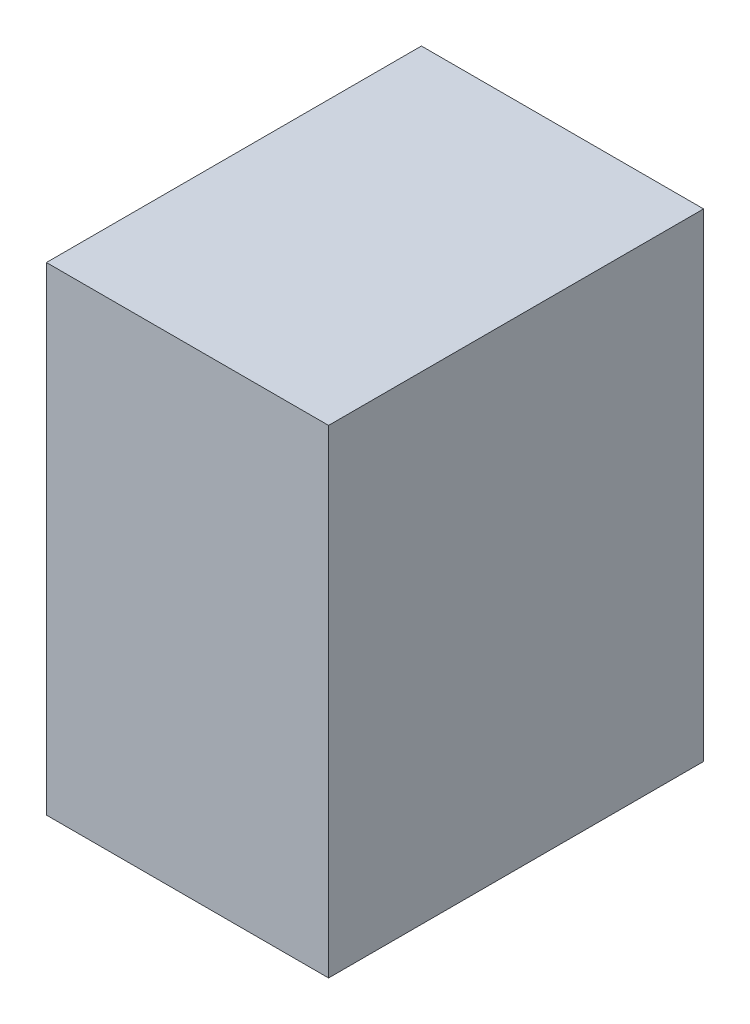
ISO-10303-21;
HEADER;
FILE_DESCRIPTION(('STEP AP214'),'2;1');
FILE_NAME('part.step','',(''),(''),'','','');
FILE_SCHEMA(('AUTOMOTIVE_DESIGN { 1 0 10303 214 1 1 1 1 }'));
ENDSEC;
DATA;
#1=APPLICATION_CONTEXT('core data for automotive mechanical design processes');
#2=APPLICATION_PROTOCOL_DEFINITION('international standard','automotive_design',2000,#1);
#3=PRODUCT_CONTEXT('',#1,'mechanical');
#4=PRODUCT('Part','Part','',(#3));
#5=PRODUCT_RELATED_PRODUCT_CATEGORY('part','',(#4));
#6=PRODUCT_DEFINITION_FORMATION('','',#4);
#7=PRODUCT_DEFINITION_CONTEXT('part definition',#1,'design');
#8=PRODUCT_DEFINITION('design','',#6,#7);
#9=PRODUCT_DEFINITION_SHAPE('','',#8);
#10=(LENGTH_UNIT() NAMED_UNIT(*) SI_UNIT(.MILLI.,.METRE.));
#11=(NAMED_UNIT(*) PLANE_ANGLE_UNIT() SI_UNIT($,.RADIAN.));
#12=(NAMED_UNIT(*) SI_UNIT($,.STERADIAN.) SOLID_ANGLE_UNIT());
#13=UNCERTAINTY_MEASURE_WITH_UNIT(LENGTH_MEASURE(1.E-05),#10,'distance_accuracy_value','');
#14=(GEOMETRIC_REPRESENTATION_CONTEXT(3) GLOBAL_UNCERTAINTY_ASSIGNED_CONTEXT((#13)) GLOBAL_UNIT_ASSIGNED_CONTEXT((#10,
#11,#12)) REPRESENTATION_CONTEXT('',''));
#15=CARTESIAN_POINT('',(0.,0.,0.));
#16=DIRECTION('',(0.,0.,1.));
#17=DIRECTION('',(1.,0.,0.));
#18=AXIS2_PLACEMENT_3D('',#15,#16,#17);
#19=CARTESIAN_POINT('',(-0.3762,-0.6,1.));
#20=DIRECTION('',(1.,0.,0.));
#21=DIRECTION('',(0.,0.,-1.));
#22=AXIS2_PLACEMENT_3D('',#19,#20,#21);
#23=PLANE('',#22);
#24=DIRECTION('',(0.,-1.,0.));
#25=VECTOR('',#24,1.);
#26=CARTESIAN_POINT('',(-0.3762,-0.6,0.));
#27=LINE('',#26,#25);
#28=CARTESIAN_POINT('',(-0.3762,0.6762,0.));
#29=VERTEX_POINT('',#28);
#30=CARTESIAN_POINT('',(-0.3762,-0.6,0.));
#31=VERTEX_POINT('',#30);
#32=EDGE_CURVE('E95',#29,#31,#27,.T.);
#33=ORIENTED_EDGE('',*,*,#32,.T.);
#34=DIRECTION('',(0.,0.,-1.));
#35=VECTOR('',#34,1.);
#36=CARTESIAN_POINT('',(-0.3762,-0.6,1.));
#37=LINE('',#36,#35);
#38=CARTESIAN_POINT('',(-0.3762,-0.6,1.));
#39=VERTEX_POINT('',#38);
#40=EDGE_CURVE('E11',#39,#31,#37,.T.);
#41=ORIENTED_EDGE('',*,*,#40,.F.);
#42=DIRECTION('',(0.,-1.,0.));
#43=VECTOR('',#42,1.);
#44=CARTESIAN_POINT('',(-0.3762,-0.6,1.));
#45=LINE('',#44,#43);
#46=CARTESIAN_POINT('',(-0.3762,0.6762,1.));
#47=VERTEX_POINT('',#46);
#48=EDGE_CURVE('E83',#47,#39,#45,.T.);
#49=ORIENTED_EDGE('',*,*,#48,.F.);
#50=DIRECTION('',(0.,0.,-1.));
#51=VECTOR('',#50,1.);
#52=CARTESIAN_POINT('',(-0.3762,0.6762,1.));
#53=LINE('',#52,#51);
#54=EDGE_CURVE('E91',#47,#29,#53,.T.);
#55=ORIENTED_EDGE('',*,*,#54,.T.);
#56=EDGE_LOOP('',(#33,#41,#49,#55));
#57=FACE_BOUND('',#56,.T.);
#58=ADVANCED_FACE('F32',(#57),#23,.F.);
#59=CARTESIAN_POINT('',(0.3762,-0.6,1.));
#60=DIRECTION('',(0.,1.,0.));
#61=DIRECTION('',(0.,0.,1.));
#62=AXIS2_PLACEMENT_3D('',#59,#60,#61);
#63=PLANE('',#62);
#64=DIRECTION('',(1.,0.,0.));
#65=VECTOR('',#64,1.);
#66=CARTESIAN_POINT('',(0.3762,-0.6,0.));
#67=LINE('',#66,#65);
#68=CARTESIAN_POINT('',(0.3762,-0.6,0.));
#69=VERTEX_POINT('',#68);
#70=EDGE_CURVE('E87',#31,#69,#67,.T.);
#71=ORIENTED_EDGE('',*,*,#70,.T.);
#72=DIRECTION('',(0.,0.,-1.));
#73=VECTOR('',#72,1.);
#74=CARTESIAN_POINT('',(0.3762,-0.6,1.));
#75=LINE('',#74,#73);
#76=CARTESIAN_POINT('',(0.3762,-0.6,1.));
#77=VERTEX_POINT('',#76);
#78=EDGE_CURVE('E40',#77,#69,#75,.T.);
#79=ORIENTED_EDGE('',*,*,#78,.F.);
#80=DIRECTION('',(1.,0.,0.));
#81=VECTOR('',#80,1.);
#82=CARTESIAN_POINT('',(0.3762,-0.6,1.));
#83=LINE('',#82,#81);
#84=EDGE_CURVE('E78',#39,#77,#83,.T.);
#85=ORIENTED_EDGE('',*,*,#84,.F.);
#86=ORIENTED_EDGE('',*,*,#40,.T.);
#87=EDGE_LOOP('',(#71,#79,#85,#86));
#88=FACE_BOUND('',#87,.T.);
#89=ADVANCED_FACE('F86',(#88),#63,.F.);
#90=CARTESIAN_POINT('',(0.3762,0.6762,1.));
#91=DIRECTION('',(-1.,0.,0.));
#92=DIRECTION('',(0.,0.,1.));
#93=AXIS2_PLACEMENT_3D('',#90,#91,#92);
#94=PLANE('',#93);
#95=DIRECTION('',(0.,1.,0.));
#96=VECTOR('',#95,1.);
#97=CARTESIAN_POINT('',(0.3762,0.6762,0.));
#98=LINE('',#97,#96);
#99=CARTESIAN_POINT('',(0.3762,0.6762,0.));
#100=VERTEX_POINT('',#99);
#101=EDGE_CURVE('E65',#69,#100,#98,.T.);
#102=ORIENTED_EDGE('',*,*,#101,.T.);
#103=DIRECTION('',(0.,0.,-1.));
#104=VECTOR('',#103,1.);
#105=CARTESIAN_POINT('',(0.3762,0.6762,1.));
#106=LINE('',#105,#104);
#107=CARTESIAN_POINT('',(0.3762,0.6762,1.));
#108=VERTEX_POINT('',#107);
#109=EDGE_CURVE('E88',#108,#100,#106,.T.);
#110=ORIENTED_EDGE('',*,*,#109,.F.);
#111=DIRECTION('',(0.,1.,0.));
#112=VECTOR('',#111,1.);
#113=CARTESIAN_POINT('',(0.3762,0.6762,1.));
#114=LINE('',#113,#112);
#115=EDGE_CURVE('E81',#77,#108,#114,.T.);
#116=ORIENTED_EDGE('',*,*,#115,.F.);
#117=ORIENTED_EDGE('',*,*,#78,.T.);
#118=EDGE_LOOP('',(#102,#110,#116,#117));
#119=FACE_BOUND('',#118,.T.);
#120=ADVANCED_FACE('F89',(#119),#94,.F.);
#121=CARTESIAN_POINT('',(-0.3762,0.6762,1.));
#122=DIRECTION('',(0.,-1.,0.));
#123=DIRECTION('',(0.,0.,-1.));
#124=AXIS2_PLACEMENT_3D('',#121,#122,#123);
#125=PLANE('',#124);
#126=DIRECTION('',(-1.,0.,0.));
#127=VECTOR('',#126,1.);
#128=CARTESIAN_POINT('',(-0.3762,0.6762,0.));
#129=LINE('',#128,#127);
#130=EDGE_CURVE('E71',#100,#29,#129,.T.);
#131=ORIENTED_EDGE('',*,*,#130,.T.);
#132=ORIENTED_EDGE('',*,*,#54,.F.);
#133=DIRECTION('',(-1.,0.,0.));
#134=VECTOR('',#133,1.);
#135=CARTESIAN_POINT('',(-0.3762,0.6762,1.));
#136=LINE('',#135,#134);
#137=EDGE_CURVE('E48',#108,#47,#136,.T.);
#138=ORIENTED_EDGE('',*,*,#137,.F.);
#139=ORIENTED_EDGE('',*,*,#109,.T.);
#140=EDGE_LOOP('',(#131,#132,#138,#139));
#141=FACE_BOUND('',#140,.T.);
#142=ADVANCED_FACE('F102',(#141),#125,.F.);
#143=CARTESIAN_POINT('',(0.,0.,1.));
#144=DIRECTION('',(0.,0.,-1.));
#145=DIRECTION('',(-1.,0.,0.));
#146=AXIS2_PLACEMENT_3D('',#143,#144,#145);
#147=PLANE('',#146);
#148=ORIENTED_EDGE('',*,*,#48,.T.);
#149=ORIENTED_EDGE('',*,*,#84,.T.);
#150=ORIENTED_EDGE('',*,*,#115,.T.);
#151=ORIENTED_EDGE('',*,*,#137,.T.);
#152=EDGE_LOOP('',(#148,#149,#150,#151));
#153=FACE_BOUND('',#152,.T.);
#154=ADVANCED_FACE('F79',(#153),#147,.F.);
#155=CARTESIAN_POINT('',(0.,0.,0.));
#156=DIRECTION('',(0.,0.,-1.));
#157=DIRECTION('',(-1.,0.,0.));
#158=AXIS2_PLACEMENT_3D('',#155,#156,#157);
#159=PLANE('',#158);
#160=ORIENTED_EDGE('',*,*,#32,.F.);
#161=ORIENTED_EDGE('',*,*,#130,.F.);
#162=ORIENTED_EDGE('',*,*,#101,.F.);
#163=ORIENTED_EDGE('',*,*,#70,.F.);
#164=EDGE_LOOP('',(#160,#161,#162,#163));
#165=FACE_BOUND('',#164,.T.);
#166=ADVANCED_FACE('F105',(#165),#159,.T.);
#167=CLOSED_SHELL('',(#58,#89,#120,#142,#154,#166));
#168=MANIFOLD_SOLID_BREP('B2',#167);
#169=ADVANCED_BREP_SHAPE_REPRESENTATION('',(#18,#168),#14);
#170=SHAPE_DEFINITION_REPRESENTATION(#9,#169);
ENDSEC;
END-ISO-10303-21;
